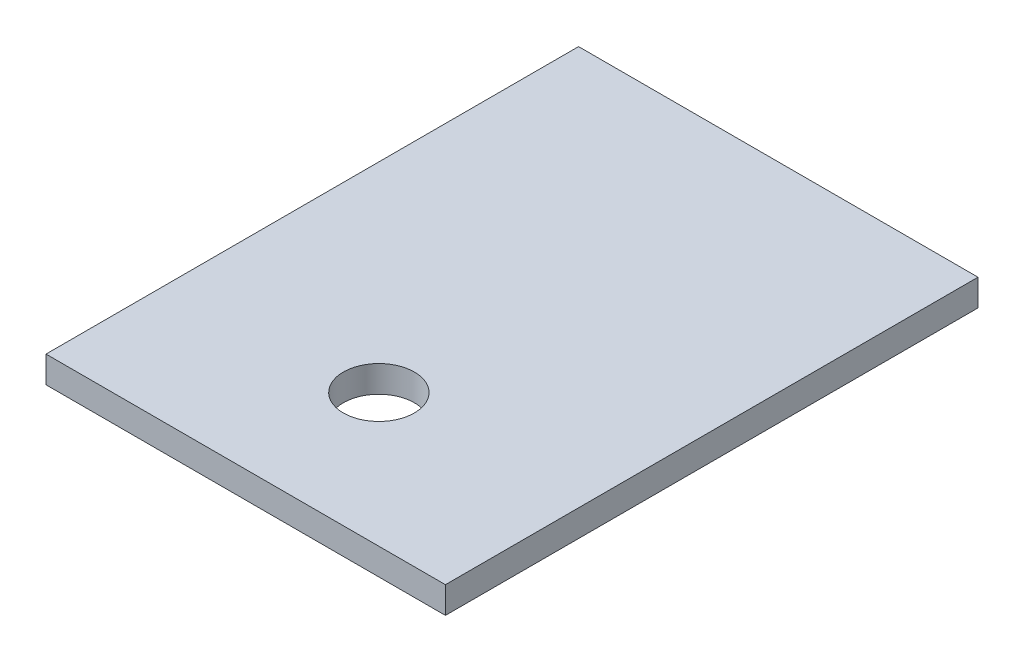
ISO-10303-21;
HEADER;
FILE_DESCRIPTION(('STEP AP214'),'2;1');
FILE_NAME('part.step','',(''),(''),'','','');
FILE_SCHEMA(('AUTOMOTIVE_DESIGN { 1 0 10303 214 1 1 1 1 }'));
ENDSEC;
DATA;
#1=APPLICATION_CONTEXT('core data for automotive mechanical design processes');
#2=APPLICATION_PROTOCOL_DEFINITION('international standard','automotive_design',2000,#1);
#3=PRODUCT_CONTEXT('',#1,'mechanical');
#4=PRODUCT('Part','Part','',(#3));
#5=PRODUCT_RELATED_PRODUCT_CATEGORY('part','',(#4));
#6=PRODUCT_DEFINITION_FORMATION('','',#4);
#7=PRODUCT_DEFINITION_CONTEXT('part definition',#1,'design');
#8=PRODUCT_DEFINITION('design','',#6,#7);
#9=PRODUCT_DEFINITION_SHAPE('','',#8);
#10=(LENGTH_UNIT() NAMED_UNIT(*) SI_UNIT(.MILLI.,.METRE.));
#11=(NAMED_UNIT(*) PLANE_ANGLE_UNIT() SI_UNIT($,.RADIAN.));
#12=(NAMED_UNIT(*) SI_UNIT($,.STERADIAN.) SOLID_ANGLE_UNIT());
#13=UNCERTAINTY_MEASURE_WITH_UNIT(LENGTH_MEASURE(1.E-05),#10,'distance_accuracy_value','');
#14=(GEOMETRIC_REPRESENTATION_CONTEXT(3) GLOBAL_UNCERTAINTY_ASSIGNED_CONTEXT((#13)) GLOBAL_UNIT_ASSIGNED_CONTEXT((#10,
#11,#12)) REPRESENTATION_CONTEXT('',''));
#15=CARTESIAN_POINT('',(0.,0.,0.));
#16=DIRECTION('',(0.,0.,1.));
#17=DIRECTION('',(1.,0.,0.));
#18=AXIS2_PLACEMENT_3D('',#15,#16,#17);
#19=CARTESIAN_POINT('',(0.,3.,0.));
#20=DIRECTION('',(0.,-1.,0.));
#21=DIRECTION('',(0.,0.,-1.));
#22=AXIS2_PLACEMENT_3D('',#19,#20,#21);
#23=PLANE('',#22);
#24=DIRECTION('',(0.,0.,1.));
#25=VECTOR('',#24,1.);
#26=CARTESIAN_POINT('',(0.,3.,0.));
#27=LINE('',#26,#25);
#28=CARTESIAN_POINT('',(0.,3.,-60.));
#29=VERTEX_POINT('',#28);
#30=CARTESIAN_POINT('',(0.,3.,0.));
#31=VERTEX_POINT('',#30);
#32=EDGE_CURVE('E92',#29,#31,#27,.T.);
#33=ORIENTED_EDGE('',*,*,#32,.T.);
#34=DIRECTION('',(1.,0.,0.));
#35=VECTOR('',#34,1.);
#36=CARTESIAN_POINT('',(0.,3.,0.));
#37=LINE('',#36,#35);
#38=CARTESIAN_POINT('',(45.,3.,0.));
#39=VERTEX_POINT('',#38);
#40=EDGE_CURVE('E87',#31,#39,#37,.T.);
#41=ORIENTED_EDGE('',*,*,#40,.T.);
#42=DIRECTION('',(0.,0.,-1.));
#43=VECTOR('',#42,1.);
#44=CARTESIAN_POINT('',(45.,3.,0.));
#45=LINE('',#44,#43);
#46=CARTESIAN_POINT('',(45.,3.,-60.));
#47=VERTEX_POINT('',#46);
#48=EDGE_CURVE('E90',#39,#47,#45,.T.);
#49=ORIENTED_EDGE('',*,*,#48,.T.);
#50=DIRECTION('',(-1.,0.,0.));
#51=VECTOR('',#50,1.);
#52=CARTESIAN_POINT('',(0.,3.,-60.));
#53=LINE('',#52,#51);
#54=EDGE_CURVE('E57',#47,#29,#53,.T.);
#55=ORIENTED_EDGE('',*,*,#54,.T.);
#56=EDGE_LOOP('',(#33,#41,#49,#55));
#57=FACE_BOUND('',#56,.T.);
#58=CARTESIAN_POINT('',(22.5,3.,-15.));
#59=DIRECTION('',(0.,1.,0.));
#60=DIRECTION('',(0.,0.,1.));
#61=AXIS2_PLACEMENT_3D('',#58,#59,#60);
#62=CIRCLE('',#61,4.);
#63=CARTESIAN_POINT('',(22.5,3.,-11.));
#64=VERTEX_POINT('',#63);
#65=EDGE_CURVE('E112',#64,#64,#62,.T.);
#66=ORIENTED_EDGE('',*,*,#65,.F.);
#67=EDGE_LOOP('',(#66));
#68=FACE_BOUND('',#67,.T.);
#69=ADVANCED_FACE('F39',(#57,#68),#23,.F.);
#70=CARTESIAN_POINT('',(0.,0.,0.));
#71=DIRECTION('',(0.,-1.,0.));
#72=DIRECTION('',(0.,0.,-1.));
#73=AXIS2_PLACEMENT_3D('',#70,#71,#72);
#74=PLANE('',#73);
#75=DIRECTION('',(0.,0.,1.));
#76=VECTOR('',#75,1.);
#77=CARTESIAN_POINT('',(0.,0.,0.));
#78=LINE('',#77,#76);
#79=CARTESIAN_POINT('',(0.,0.,-60.));
#80=VERTEX_POINT('',#79);
#81=CARTESIAN_POINT('',(0.,0.,0.));
#82=VERTEX_POINT('',#81);
#83=EDGE_CURVE('E108',#80,#82,#78,.T.);
#84=ORIENTED_EDGE('',*,*,#83,.F.);
#85=DIRECTION('',(-1.,0.,0.));
#86=VECTOR('',#85,1.);
#87=CARTESIAN_POINT('',(0.,0.,-60.));
#88=LINE('',#87,#86);
#89=CARTESIAN_POINT('',(45.,0.,-60.));
#90=VERTEX_POINT('',#89);
#91=EDGE_CURVE('E80',#90,#80,#88,.T.);
#92=ORIENTED_EDGE('',*,*,#91,.F.);
#93=DIRECTION('',(0.,0.,-1.));
#94=VECTOR('',#93,1.);
#95=CARTESIAN_POINT('',(45.,0.,0.));
#96=LINE('',#95,#94);
#97=CARTESIAN_POINT('',(45.,0.,0.));
#98=VERTEX_POINT('',#97);
#99=EDGE_CURVE('E74',#98,#90,#96,.T.);
#100=ORIENTED_EDGE('',*,*,#99,.F.);
#101=DIRECTION('',(1.,0.,0.));
#102=VECTOR('',#101,1.);
#103=CARTESIAN_POINT('',(0.,0.,0.));
#104=LINE('',#103,#102);
#105=EDGE_CURVE('E97',#82,#98,#104,.T.);
#106=ORIENTED_EDGE('',*,*,#105,.F.);
#107=EDGE_LOOP('',(#84,#92,#100,#106));
#108=FACE_BOUND('',#107,.T.);
#109=CARTESIAN_POINT('',(22.5,0.,-15.));
#110=DIRECTION('',(0.,1.,0.));
#111=DIRECTION('',(0.,0.,1.));
#112=AXIS2_PLACEMENT_3D('',#109,#110,#111);
#113=CIRCLE('',#112,4.);
#114=CARTESIAN_POINT('',(22.5,0.,-11.));
#115=VERTEX_POINT('',#114);
#116=EDGE_CURVE('E130',#115,#115,#113,.T.);
#117=ORIENTED_EDGE('',*,*,#116,.T.);
#118=EDGE_LOOP('',(#117));
#119=FACE_BOUND('',#118,.T.);
#120=ADVANCED_FACE('F125',(#108,#119),#74,.T.);
#121=CARTESIAN_POINT('',(0.,3.,0.));
#122=DIRECTION('',(1.,0.,0.));
#123=DIRECTION('',(0.,0.,-1.));
#124=AXIS2_PLACEMENT_3D('',#121,#122,#123);
#125=PLANE('',#124);
#126=ORIENTED_EDGE('',*,*,#83,.T.);
#127=DIRECTION('',(0.,-1.,0.));
#128=VECTOR('',#127,1.);
#129=CARTESIAN_POINT('',(0.,3.,0.));
#130=LINE('',#129,#128);
#131=EDGE_CURVE('E11',#31,#82,#130,.T.);
#132=ORIENTED_EDGE('',*,*,#131,.F.);
#133=ORIENTED_EDGE('',*,*,#32,.F.);
#134=DIRECTION('',(0.,-1.,0.));
#135=VECTOR('',#134,1.);
#136=CARTESIAN_POINT('',(0.,3.,-60.));
#137=LINE('',#136,#135);
#138=EDGE_CURVE('E104',#29,#80,#137,.T.);
#139=ORIENTED_EDGE('',*,*,#138,.T.);
#140=EDGE_LOOP('',(#126,#132,#133,#139));
#141=FACE_BOUND('',#140,.T.);
#142=ADVANCED_FACE('F41',(#141),#125,.F.);
#143=CARTESIAN_POINT('',(0.,3.,0.));
#144=DIRECTION('',(0.,0.,-1.));
#145=DIRECTION('',(-1.,0.,0.));
#146=AXIS2_PLACEMENT_3D('',#143,#144,#145);
#147=PLANE('',#146);
#148=ORIENTED_EDGE('',*,*,#105,.T.);
#149=DIRECTION('',(0.,-1.,0.));
#150=VECTOR('',#149,1.);
#151=CARTESIAN_POINT('',(45.,3.,0.));
#152=LINE('',#151,#150);
#153=EDGE_CURVE('E49',#39,#98,#152,.T.);
#154=ORIENTED_EDGE('',*,*,#153,.F.);
#155=ORIENTED_EDGE('',*,*,#40,.F.);
#156=ORIENTED_EDGE('',*,*,#131,.T.);
#157=EDGE_LOOP('',(#148,#154,#155,#156));
#158=FACE_BOUND('',#157,.T.);
#159=ADVANCED_FACE('F96',(#158),#147,.F.);
#160=CARTESIAN_POINT('',(45.,3.,0.));
#161=DIRECTION('',(-1.,0.,0.));
#162=DIRECTION('',(0.,0.,1.));
#163=AXIS2_PLACEMENT_3D('',#160,#161,#162);
#164=PLANE('',#163);
#165=ORIENTED_EDGE('',*,*,#99,.T.);
#166=DIRECTION('',(0.,-1.,0.));
#167=VECTOR('',#166,1.);
#168=CARTESIAN_POINT('',(45.,3.,-60.));
#169=LINE('',#168,#167);
#170=EDGE_CURVE('E99',#47,#90,#169,.T.);
#171=ORIENTED_EDGE('',*,*,#170,.F.);
#172=ORIENTED_EDGE('',*,*,#48,.F.);
#173=ORIENTED_EDGE('',*,*,#153,.T.);
#174=EDGE_LOOP('',(#165,#171,#172,#173));
#175=FACE_BOUND('',#174,.T.);
#176=ADVANCED_FACE('F100',(#175),#164,.F.);
#177=CARTESIAN_POINT('',(0.,3.,-60.));
#178=DIRECTION('',(0.,0.,1.));
#179=DIRECTION('',(1.,0.,0.));
#180=AXIS2_PLACEMENT_3D('',#177,#178,#179);
#181=PLANE('',#180);
#182=ORIENTED_EDGE('',*,*,#91,.T.);
#183=ORIENTED_EDGE('',*,*,#138,.F.);
#184=ORIENTED_EDGE('',*,*,#54,.F.);
#185=ORIENTED_EDGE('',*,*,#170,.T.);
#186=EDGE_LOOP('',(#182,#183,#184,#185));
#187=FACE_BOUND('',#186,.T.);
#188=ADVANCED_FACE('F122',(#187),#181,.F.);
#189=CARTESIAN_POINT('',(22.5,3.,-15.));
#190=DIRECTION('',(0.,-1.,0.));
#191=DIRECTION('',(0.,0.,-1.));
#192=AXIS2_PLACEMENT_3D('',#189,#190,#191);
#193=CYLINDRICAL_SURFACE('',#192,4.);
#194=ORIENTED_EDGE('',*,*,#65,.T.);
#195=EDGE_LOOP('',(#194));
#196=FACE_BOUND('',#195,.T.);
#197=ORIENTED_EDGE('',*,*,#116,.F.);
#198=EDGE_LOOP('',(#197));
#199=FACE_BOUND('',#198,.T.);
#200=ADVANCED_FACE('F138',(#196,#199),#193,.F.);
#201=CLOSED_SHELL('',(#69,#120,#142,#159,#176,#188,#200));
#202=MANIFOLD_SOLID_BREP('B2',#201);
#203=ADVANCED_BREP_SHAPE_REPRESENTATION('',(#18,#202),#14);
#204=SHAPE_DEFINITION_REPRESENTATION(#9,#203);
ENDSEC;
END-ISO-10303-21;
